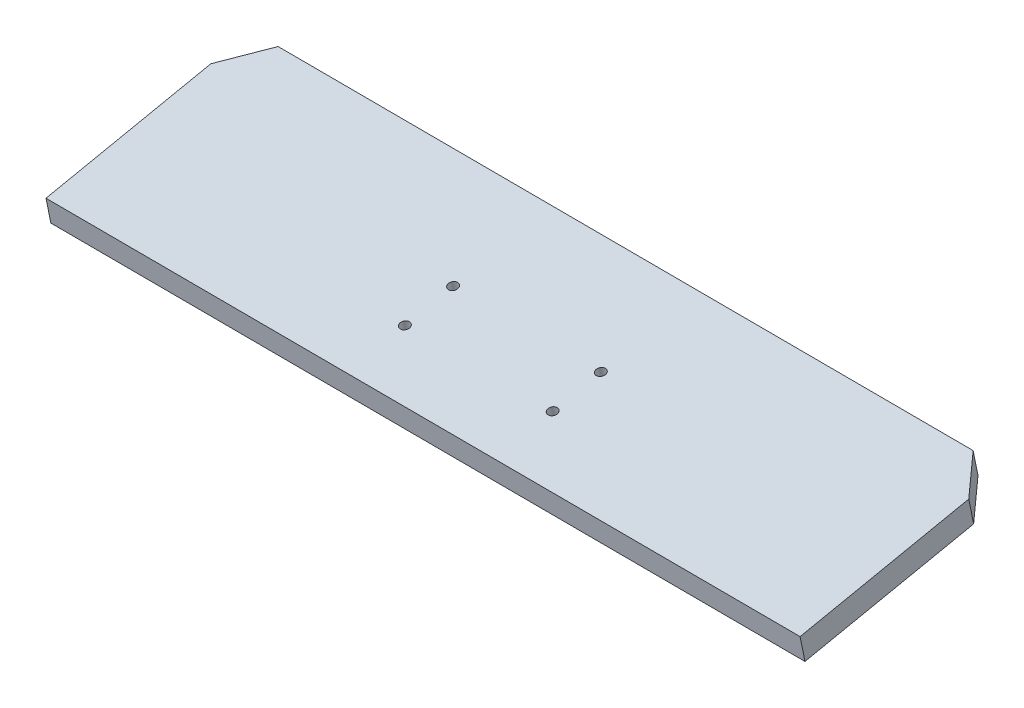
ISO-10303-21;
HEADER;
FILE_DESCRIPTION(('STEP AP214'),'2;1');
FILE_NAME('part.step','',(''),(''),'','','');
FILE_SCHEMA(('AUTOMOTIVE_DESIGN { 1 0 10303 214 1 1 1 1 }'));
ENDSEC;
DATA;
#1=APPLICATION_CONTEXT('core data for automotive mechanical design processes');
#2=APPLICATION_PROTOCOL_DEFINITION('international standard','automotive_design',2000,#1);
#3=PRODUCT_CONTEXT('',#1,'mechanical');
#4=PRODUCT('Part','Part','',(#3));
#5=PRODUCT_RELATED_PRODUCT_CATEGORY('part','',(#4));
#6=PRODUCT_DEFINITION_FORMATION('','',#4);
#7=PRODUCT_DEFINITION_CONTEXT('part definition',#1,'design');
#8=PRODUCT_DEFINITION('design','',#6,#7);
#9=PRODUCT_DEFINITION_SHAPE('','',#8);
#10=(LENGTH_UNIT() NAMED_UNIT(*) SI_UNIT(.MILLI.,.METRE.));
#11=(NAMED_UNIT(*) PLANE_ANGLE_UNIT() SI_UNIT($,.RADIAN.));
#12=(NAMED_UNIT(*) SI_UNIT($,.STERADIAN.) SOLID_ANGLE_UNIT());
#13=UNCERTAINTY_MEASURE_WITH_UNIT(LENGTH_MEASURE(1.E-05),#10,'distance_accuracy_value','');
#14=(GEOMETRIC_REPRESENTATION_CONTEXT(3) GLOBAL_UNCERTAINTY_ASSIGNED_CONTEXT((#13)) GLOBAL_UNIT_ASSIGNED_CONTEXT((#10,
#11,#12)) REPRESENTATION_CONTEXT('',''));
#15=CARTESIAN_POINT('',(0.,0.,0.));
#16=DIRECTION('',(0.,0.,1.));
#17=DIRECTION('',(1.,0.,0.));
#18=AXIS2_PLACEMENT_3D('',#15,#16,#17);
#19=CARTESIAN_POINT('',(97.422099153174,78.6378775801606,408.045001741372));
#20=DIRECTION('',(0.,0.202078468660463,-0.979369334063428));
#21=DIRECTION('',(0.,0.979369334063428,0.202078468660463));
#22=AXIS2_PLACEMENT_3D('',#19,#20,#21);
#23=PLANE('',#22);
#24=DIRECTION('',(0.999990097879295,-0.00435837437046662,-0.000899286497953613));
#25=VECTOR('',#24,1.);
#26=CARTESIAN_POINT('',(97.3938404806897,72.4189438900997,406.761816171762));
#27=LINE('',#26,#25);
#28=CARTESIAN_POINT('',(-97.0702765342321,73.266499706273,406.93669685822));
#29=VERTEX_POINT('',#28);
#30=CARTESIAN_POINT('',(97.3938404806897,72.4189438900997,406.761816171762));
#31=VERTEX_POINT('',#30);
#32=EDGE_CURVE('E119',#29,#31,#27,.T.);
#33=ORIENTED_EDGE('',*,*,#32,.T.);
#34=DIRECTION('',(-0.0044501846431965,-0.979359636230067,-0.202076467655074));
#35=VECTOR('',#34,1.);
#36=CARTESIAN_POINT('',(97.422099153174,78.6378775801606,408.045001741372));
#37=LINE('',#36,#35);
#38=CARTESIAN_POINT('',(97.422099153174,78.6378775801606,408.045001741372));
#39=VERTEX_POINT('',#38);
#40=EDGE_CURVE('E11',#39,#31,#37,.T.);
#41=ORIENTED_EDGE('',*,*,#40,.F.);
#42=DIRECTION('',(0.999990097879295,-0.00435837437046662,-0.000899286497953613));
#43=VECTOR('',#42,1.);
#44=CARTESIAN_POINT('',(97.422099153174,78.6378775801606,408.045001741372));
#45=LINE('',#44,#43);
#46=CARTESIAN_POINT('',(-97.0420178617478,79.4854333963339,408.219882427829));
#47=VERTEX_POINT('',#46);
#48=EDGE_CURVE('E130',#47,#39,#45,.T.);
#49=ORIENTED_EDGE('',*,*,#48,.F.);
#50=DIRECTION('',(-0.0044501846431965,-0.979359636230067,-0.202076467655074));
#51=VECTOR('',#50,1.);
#52=CARTESIAN_POINT('',(-97.0420178617478,79.4854333963339,408.219882427829));
#53=LINE('',#52,#51);
#54=EDGE_CURVE('E115',#47,#29,#53,.T.);
#55=ORIENTED_EDGE('',*,*,#54,.T.);
#56=EDGE_LOOP('',(#33,#41,#49,#55));
#57=FACE_BOUND('',#56,.T.);
#58=ADVANCED_FACE('F33',(#57),#23,.F.);
#59=CARTESIAN_POINT('',(97.422099153174,78.6378775801606,408.045001741372));
#60=DIRECTION('',(-0.999990097879295,0.00435837437046665,0.000899286497953456));
#61=DIRECTION('',(-0.00435837613281171,-0.999990502233639,0.));
#62=AXIS2_PLACEMENT_3D('',#59,#60,#61);
#63=PLANE('',#62);
#64=DIRECTION('',(0.,0.202078468660462,-0.979369334063428));
#65=VECTOR('',#64,1.);
#66=CARTESIAN_POINT('',(97.3938404806897,72.4189438900997,406.761816171762));
#67=LINE('',#66,#65);
#68=CARTESIAN_POINT('',(97.3938404806897,81.4013318220573,363.228849272643));
#69=VERTEX_POINT('',#68);
#70=EDGE_CURVE('E122',#31,#69,#67,.T.);
#71=ORIENTED_EDGE('',*,*,#70,.T.);
#72=DIRECTION('',(-0.0044501846431965,-0.979359636230067,-0.202076467655074));
#73=VECTOR('',#72,1.);
#74=CARTESIAN_POINT('',(97.422099153174,87.6202655121182,364.512034842252));
#75=LINE('',#74,#73);
#76=CARTESIAN_POINT('',(97.422099153174,87.6202655121182,364.512034842252));
#77=VERTEX_POINT('',#76);
#78=EDGE_CURVE('E42',#77,#69,#75,.T.);
#79=ORIENTED_EDGE('',*,*,#78,.F.);
#80=DIRECTION('',(0.,0.202078468660462,-0.979369334063428));
#81=VECTOR('',#80,1.);
#82=CARTESIAN_POINT('',(97.422099153174,78.6378775801606,408.045001741372));
#83=LINE('',#82,#81);
#84=EDGE_CURVE('E88',#39,#77,#83,.T.);
#85=ORIENTED_EDGE('',*,*,#84,.F.);
#86=ORIENTED_EDGE('',*,*,#40,.T.);
#87=EDGE_LOOP('',(#71,#79,#85,#86));
#88=FACE_BOUND('',#87,.T.);
#89=ADVANCED_FACE('F162',(#88),#63,.F.);
#90=CARTESIAN_POINT('',(97.422099153174,87.6202655121182,364.512034842252));
#91=DIRECTION('',(-0.757621319258177,-0.128591688377846,0.63990164422795));
#92=DIRECTION('',(0.645258825539128,0.,0.763964035844532));
#93=AXIS2_PLACEMENT_3D('',#90,#91,#92);
#94=PLANE('',#93);
#95=DIRECTION('',(-0.652679195671304,0.155945120486169,-0.74141148287197));
#96=VECTOR('',#95,1.);
#97=CARTESIAN_POINT('',(97.3938404806897,81.4013318220573,363.228849272643));
#98=LINE('',#97,#96);
#99=CARTESIAN_POINT('',(89.1048146956641,83.3818348522316,353.812923440169));
#100=VERTEX_POINT('',#99);
#101=EDGE_CURVE('E125',#69,#100,#98,.T.);
#102=ORIENTED_EDGE('',*,*,#101,.T.);
#103=DIRECTION('',(-0.0044501846431965,-0.979359636230067,-0.202076467655074));
#104=VECTOR('',#103,1.);
#105=CARTESIAN_POINT('',(89.1330733681484,89.6007685422925,355.096109009778));
#106=LINE('',#105,#104);
#107=CARTESIAN_POINT('',(89.1330733681484,89.6007685422925,355.096109009778));
#108=VERTEX_POINT('',#107);
#109=EDGE_CURVE('E110',#108,#100,#106,.T.);
#110=ORIENTED_EDGE('',*,*,#109,.F.);
#111=DIRECTION('',(-0.652679195671304,0.155945120486169,-0.74141148287197));
#112=VECTOR('',#111,1.);
#113=CARTESIAN_POINT('',(97.422099153174,87.6202655121182,364.512034842252));
#114=LINE('',#113,#112);
#115=EDGE_CURVE('E101',#77,#108,#114,.T.);
#116=ORIENTED_EDGE('',*,*,#115,.F.);
#117=ORIENTED_EDGE('',*,*,#78,.T.);
#118=EDGE_LOOP('',(#102,#110,#116,#117));
#119=FACE_BOUND('',#118,.T.);
#120=ADVANCED_FACE('F165',(#119),#94,.F.);
#121=CARTESIAN_POINT('',(89.1330733681484,89.6007685422925,355.096109009778));
#122=DIRECTION('',(0.,-0.202078468660463,0.979369334063428));
#123=DIRECTION('',(0.,-0.979369334063428,-0.202078468660463));
#124=AXIS2_PLACEMENT_3D('',#121,#122,#123);
#125=PLANE('',#124);
#126=DIRECTION('',(-0.999990097879295,0.00435837437046663,0.000899286497953437));
#127=VECTOR('',#126,1.);
#128=CARTESIAN_POINT('',(89.1048146956641,83.3818348522316,353.812923440169));
#129=LINE('',#128,#127);
#130=CARTESIAN_POINT('',(-90.1246620164566,84.1629917450757,353.974103684637));
#131=VERTEX_POINT('',#130);
#132=EDGE_CURVE('E109',#100,#131,#129,.T.);
#133=ORIENTED_EDGE('',*,*,#132,.T.);
#134=DIRECTION('',(-0.0044501846431965,-0.979359636230067,-0.202076467655074));
#135=VECTOR('',#134,1.);
#136=CARTESIAN_POINT('',(-90.0964033439723,90.3819254351366,355.257289254247));
#137=LINE('',#136,#135);
#138=CARTESIAN_POINT('',(-90.0964033439723,90.3819254351366,355.257289254247));
#139=VERTEX_POINT('',#138);
#140=EDGE_CURVE('E106',#139,#131,#137,.T.);
#141=ORIENTED_EDGE('',*,*,#140,.F.);
#142=DIRECTION('',(-0.999990097879295,0.00435837437046663,0.000899286497953437));
#143=VECTOR('',#142,1.);
#144=CARTESIAN_POINT('',(89.1330733681484,89.6007685422925,355.096109009778));
#145=LINE('',#144,#143);
#146=EDGE_CURVE('E95',#108,#139,#145,.T.);
#147=ORIENTED_EDGE('',*,*,#146,.F.);
#148=ORIENTED_EDGE('',*,*,#109,.T.);
#149=EDGE_LOOP('',(#133,#141,#147,#148));
#150=FACE_BOUND('',#149,.T.);
#151=ADVANCED_FACE('F107',(#150),#125,.F.);
#152=CARTESIAN_POINT('',(-97.0420178617478,88.2636224531486,365.676561371193));
#153=DIRECTION('',(0.837186908209258,-0.114166372615275,0.534868320324633));
#154=DIRECTION('',(0.538388495632697,0.,-0.842696759083813));
#155=AXIS2_PLACEMENT_3D('',#152,#153,#154);
#156=PLANE('',#155);
#157=DIRECTION('',(-0.546898780927207,-0.166795510392757,0.820415127318575));
#158=VECTOR('',#157,1.);
#159=CARTESIAN_POINT('',(-97.0702765342321,82.0446887630877,364.393375801583));
#160=LINE('',#159,#158);
#161=CARTESIAN_POINT('',(-97.0702765342321,82.0446887630877,364.393375801583));
#162=VERTEX_POINT('',#161);
#163=EDGE_CURVE('E74',#131,#162,#160,.T.);
#164=ORIENTED_EDGE('',*,*,#163,.T.);
#165=DIRECTION('',(-0.0044501846431965,-0.979359636230067,-0.202076467655074));
#166=VECTOR('',#165,1.);
#167=CARTESIAN_POINT('',(-97.0420178617478,88.2636224531486,365.676561371193));
#168=LINE('',#167,#166);
#169=CARTESIAN_POINT('',(-97.0420178617478,88.2636224531486,365.676561371193));
#170=VERTEX_POINT('',#169);
#171=EDGE_CURVE('E111',#170,#162,#168,.T.);
#172=ORIENTED_EDGE('',*,*,#171,.F.);
#173=DIRECTION('',(-0.546898780927207,-0.166795510392757,0.820415127318575));
#174=VECTOR('',#173,1.);
#175=CARTESIAN_POINT('',(-97.0420178617478,88.2636224531486,365.676561371193));
#176=LINE('',#175,#174);
#177=EDGE_CURVE('E99',#139,#170,#176,.T.);
#178=ORIENTED_EDGE('',*,*,#177,.F.);
#179=ORIENTED_EDGE('',*,*,#140,.T.);
#180=EDGE_LOOP('',(#164,#172,#178,#179));
#181=FACE_BOUND('',#180,.T.);
#182=ADVANCED_FACE('F113',(#181),#156,.F.);
#183=CARTESIAN_POINT('',(-97.0420178617478,79.4854333963339,408.219882427829));
#184=DIRECTION('',(0.999990097879295,-0.00435837437046672,-0.000899286497953144));
#185=DIRECTION('',(0.00435837613281178,0.999990502233639,0.));
#186=AXIS2_PLACEMENT_3D('',#183,#184,#185);
#187=PLANE('',#186);
#188=DIRECTION('',(0.,-0.202078468660463,0.979369334063428));
#189=VECTOR('',#188,1.);
#190=CARTESIAN_POINT('',(-97.0702765342321,73.266499706273,406.93669685822));
#191=LINE('',#190,#189);
#192=EDGE_CURVE('E80',#162,#29,#191,.T.);
#193=ORIENTED_EDGE('',*,*,#192,.T.);
#194=ORIENTED_EDGE('',*,*,#54,.F.);
#195=DIRECTION('',(0.,-0.202078468660463,0.979369334063428));
#196=VECTOR('',#195,1.);
#197=CARTESIAN_POINT('',(-97.0420178617478,79.4854333963339,408.219882427829));
#198=LINE('',#197,#196);
#199=EDGE_CURVE('E51',#170,#47,#198,.T.);
#200=ORIENTED_EDGE('',*,*,#199,.F.);
#201=ORIENTED_EDGE('',*,*,#171,.T.);
#202=EDGE_LOOP('',(#193,#194,#200,#201));
#203=FACE_BOUND('',#202,.T.);
#204=ADVANCED_FACE('F170',(#203),#187,.F.);
#205=CARTESIAN_POINT('',(-97.0420178617478,79.4854333963339,408.219882427829));
#206=DIRECTION('',(-0.0044501846431965,-0.979359636230067,-0.202076467655074));
#207=DIRECTION('',(0.,0.202078468660463,-0.979369334063428));
#208=AXIS2_PLACEMENT_3D('',#205,#206,#207);
#209=PLANE('',#208);
#210=CARTESIAN_POINT('',(-19.5314763525125,84.8199028980133,380.659521754554));
#211=DIRECTION('',(0.0044501846431965,0.979359636230067,0.202076467655074));
#212=DIRECTION('',(0.,0.202078468660463,-0.979369334063428));
#213=AXIS2_PLACEMENT_3D('',#210,#211,#212);
#214=CIRCLE('',#213,1.19062500000001);
#215=CARTESIAN_POINT('',(-19.5314763525125,85.0605025747621,379.493460141185));
#216=VERTEX_POINT('',#215);
#217=EDGE_CURVE('E154',#216,#216,#214,.T.);
#218=ORIENTED_EDGE('',*,*,#217,.F.);
#219=EDGE_LOOP('',(#218));
#220=FACE_BOUND('',#219,.T.);
#221=CARTESIAN_POINT('',(-19.5314763525125,82.2535063460254,393.09751229716));
#222=DIRECTION('',(0.0044501846431965,0.979359636230067,0.202076467655074));
#223=DIRECTION('',(0.,-0.202078468660463,0.979369334063428));
#224=AXIS2_PLACEMENT_3D('',#221,#222,#223);
#225=CIRCLE('',#224,1.19062500000002);
#226=CARTESIAN_POINT('',(-19.5314763525125,82.0129066692765,394.263573910529));
#227=VERTEX_POINT('',#226);
#228=EDGE_CURVE('E144',#227,#227,#225,.T.);
#229=ORIENTED_EDGE('',*,*,#228,.F.);
#230=EDGE_LOOP('',(#229));
#231=FACE_BOUND('',#230,.T.);
#232=CARTESIAN_POINT('',(18.5681463766886,82.0874522825106,393.063249481588));
#233=DIRECTION('',(0.0044501846431965,0.979359636230067,0.202076467655074));
#234=DIRECTION('',(0.,0.202078468660463,-0.979369334063428));
#235=AXIS2_PLACEMENT_3D('',#232,#233,#234);
#236=CIRCLE('',#235,1.19062500000001);
#237=CARTESIAN_POINT('',(18.5681463766886,82.3280519592594,391.897187868218));
#238=VERTEX_POINT('',#237);
#239=EDGE_CURVE('E141',#238,#238,#236,.T.);
#240=ORIENTED_EDGE('',*,*,#239,.F.);
#241=EDGE_LOOP('',(#240));
#242=FACE_BOUND('',#241,.T.);
#243=CARTESIAN_POINT('',(18.5681463766886,84.6538488344985,380.625258938982));
#244=DIRECTION('',(0.0044501846431965,0.979359636230067,0.202076467655074));
#245=DIRECTION('',(0.,-0.202078468660463,0.979369334063428));
#246=AXIS2_PLACEMENT_3D('',#243,#244,#245);
#247=CIRCLE('',#246,1.19062500000002);
#248=CARTESIAN_POINT('',(18.5681463766886,84.4132491577496,381.791320552351));
#249=VERTEX_POINT('',#248);
#250=EDGE_CURVE('E138',#249,#249,#247,.T.);
#251=ORIENTED_EDGE('',*,*,#250,.F.);
#252=EDGE_LOOP('',(#251));
#253=FACE_BOUND('',#252,.T.);
#254=ORIENTED_EDGE('',*,*,#48,.T.);
#255=ORIENTED_EDGE('',*,*,#84,.T.);
#256=ORIENTED_EDGE('',*,*,#115,.T.);
#257=ORIENTED_EDGE('',*,*,#146,.T.);
#258=ORIENTED_EDGE('',*,*,#177,.T.);
#259=ORIENTED_EDGE('',*,*,#199,.T.);
#260=EDGE_LOOP('',(#254,#255,#256,#257,#258,#259));
#261=FACE_BOUND('',#260,.T.);
#262=ADVANCED_FACE('F97',(#220,#231,#242,#253,#261),#209,.F.);
#263=CARTESIAN_POINT('',(-97.0702765342321,73.266499706273,406.93669685822));
#264=DIRECTION('',(-0.0044501846431965,-0.979359636230067,-0.202076467655074));
#265=DIRECTION('',(0.,0.202078468660463,-0.979369334063428));
#266=AXIS2_PLACEMENT_3D('',#263,#264,#265);
#267=PLANE('',#266);
#268=CARTESIAN_POINT('',(-19.5597350249968,78.6009692079523,379.376336184944));
#269=DIRECTION('',(-0.0044501846431965,-0.979359636230067,-0.202076467655074));
#270=DIRECTION('',(0.,0.202078468660463,-0.979369334063428));
#271=AXIS2_PLACEMENT_3D('',#268,#269,#270);
#272=CIRCLE('',#271,1.19062500000001);
#273=CARTESIAN_POINT('',(-19.5597350249968,78.8415688847012,378.210274571575));
#274=VERTEX_POINT('',#273);
#275=EDGE_CURVE('E36',#274,#274,#272,.T.);
#276=ORIENTED_EDGE('',*,*,#275,.F.);
#277=EDGE_LOOP('',(#276));
#278=FACE_BOUND('',#277,.T.);
#279=CARTESIAN_POINT('',(-19.5597350249968,76.0345726559644,391.81432672755));
#280=DIRECTION('',(-0.0044501846431965,-0.979359636230067,-0.202076467655074));
#281=DIRECTION('',(0.,0.202078468660463,-0.979369334063428));
#282=AXIS2_PLACEMENT_3D('',#279,#280,#281);
#283=CIRCLE('',#282,1.19062500000002);
#284=CARTESIAN_POINT('',(-19.5597350249968,76.2751723327133,390.648265114181));
#285=VERTEX_POINT('',#284);
#286=EDGE_CURVE('E142',#285,#285,#283,.T.);
#287=ORIENTED_EDGE('',*,*,#286,.F.);
#288=EDGE_LOOP('',(#287));
#289=FACE_BOUND('',#288,.T.);
#290=CARTESIAN_POINT('',(18.5398877042043,75.8685185924496,391.780063911978));
#291=DIRECTION('',(-0.0044501846431965,-0.979359636230067,-0.202076467655074));
#292=DIRECTION('',(0.,0.202078468660463,-0.979369334063428));
#293=AXIS2_PLACEMENT_3D('',#290,#291,#292);
#294=CIRCLE('',#293,1.19062500000001);
#295=CARTESIAN_POINT('',(18.5398877042043,76.1091182691985,390.614002298609));
#296=VERTEX_POINT('',#295);
#297=EDGE_CURVE('E139',#296,#296,#294,.T.);
#298=ORIENTED_EDGE('',*,*,#297,.F.);
#299=EDGE_LOOP('',(#298));
#300=FACE_BOUND('',#299,.T.);
#301=CARTESIAN_POINT('',(18.5398877042043,78.4349151444375,379.342073369372));
#302=DIRECTION('',(-0.0044501846431965,-0.979359636230067,-0.202076467655074));
#303=DIRECTION('',(0.,0.202078468660463,-0.979369334063428));
#304=AXIS2_PLACEMENT_3D('',#301,#302,#303);
#305=CIRCLE('',#304,1.19062500000002);
#306=CARTESIAN_POINT('',(18.5398877042043,78.6755148211864,378.176011756003));
#307=VERTEX_POINT('',#306);
#308=EDGE_CURVE('E123',#307,#307,#305,.T.);
#309=ORIENTED_EDGE('',*,*,#308,.F.);
#310=EDGE_LOOP('',(#309));
#311=FACE_BOUND('',#310,.T.);
#312=ORIENTED_EDGE('',*,*,#32,.F.);
#313=ORIENTED_EDGE('',*,*,#192,.F.);
#314=ORIENTED_EDGE('',*,*,#163,.F.);
#315=ORIENTED_EDGE('',*,*,#132,.F.);
#316=ORIENTED_EDGE('',*,*,#101,.F.);
#317=ORIENTED_EDGE('',*,*,#70,.F.);
#318=EDGE_LOOP('',(#312,#313,#314,#315,#316,#317));
#319=FACE_BOUND('',#318,.T.);
#320=ADVANCED_FACE('F168',(#278,#289,#300,#311,#319),#267,.T.);
#321=CARTESIAN_POINT('',(18.4884207561394,67.1084971244946,377.005033471072));
#322=DIRECTION('',(0.0044501846431965,0.979359636230067,0.202076467655074));
#323=DIRECTION('',(0.,-0.202078468660463,0.979369334063428));
#324=AXIS2_PLACEMENT_3D('',#321,#322,#323);
#325=CYLINDRICAL_SURFACE('',#324,1.19062500000002);
#326=ORIENTED_EDGE('',*,*,#308,.T.);
#327=EDGE_LOOP('',(#326));
#328=FACE_BOUND('',#327,.T.);
#329=ORIENTED_EDGE('',*,*,#250,.T.);
#330=EDGE_LOOP('',(#329));
#331=FACE_BOUND('',#330,.T.);
#332=ADVANCED_FACE('F215',(#328,#331),#325,.F.);
#333=CARTESIAN_POINT('',(18.4884207561394,64.5421005725068,389.443024013677));
#334=DIRECTION('',(0.0044501846431965,0.979359636230067,0.202076467655074));
#335=DIRECTION('',(0.,-0.202078468660463,0.979369334063428));
#336=AXIS2_PLACEMENT_3D('',#333,#334,#335);
#337=CYLINDRICAL_SURFACE('',#336,1.19062500000001);
#338=ORIENTED_EDGE('',*,*,#297,.T.);
#339=EDGE_LOOP('',(#338));
#340=FACE_BOUND('',#339,.T.);
#341=ORIENTED_EDGE('',*,*,#239,.T.);
#342=EDGE_LOOP('',(#341));
#343=FACE_BOUND('',#342,.T.);
#344=ADVANCED_FACE('F223',(#340,#343),#337,.F.);
#345=CARTESIAN_POINT('',(-19.6112019730618,64.7081546360216,389.477286829249));
#346=DIRECTION('',(0.0044501846431965,0.979359636230067,0.202076467655074));
#347=DIRECTION('',(0.,-0.202078468660463,0.979369334063428));
#348=AXIS2_PLACEMENT_3D('',#345,#346,#347);
#349=CYLINDRICAL_SURFACE('',#348,1.19062500000002);
#350=ORIENTED_EDGE('',*,*,#286,.T.);
#351=EDGE_LOOP('',(#350));
#352=FACE_BOUND('',#351,.T.);
#353=ORIENTED_EDGE('',*,*,#228,.T.);
#354=EDGE_LOOP('',(#353));
#355=FACE_BOUND('',#354,.T.);
#356=ADVANCED_FACE('F233',(#352,#355),#349,.F.);
#357=CARTESIAN_POINT('',(-19.6112019730618,67.2745511880094,377.039296286644));
#358=DIRECTION('',(0.0044501846431965,0.979359636230067,0.202076467655074));
#359=DIRECTION('',(0.,-0.202078468660463,0.979369334063428));
#360=AXIS2_PLACEMENT_3D('',#357,#358,#359);
#361=CYLINDRICAL_SURFACE('',#360,1.19062500000001);
#362=ORIENTED_EDGE('',*,*,#275,.T.);
#363=EDGE_LOOP('',(#362));
#364=FACE_BOUND('',#363,.T.);
#365=ORIENTED_EDGE('',*,*,#217,.T.);
#366=EDGE_LOOP('',(#365));
#367=FACE_BOUND('',#366,.T.);
#368=ADVANCED_FACE('F243',(#364,#367),#361,.F.);
#369=CLOSED_SHELL('',(#58,#89,#120,#151,#182,#204,#262,#320,#332,#344,#356,#368));
#370=MANIFOLD_SOLID_BREP('B2',#369);
#371=ADVANCED_BREP_SHAPE_REPRESENTATION('',(#18,#370),#14);
#372=SHAPE_DEFINITION_REPRESENTATION(#9,#371);
ENDSEC;
END-ISO-10303-21;
